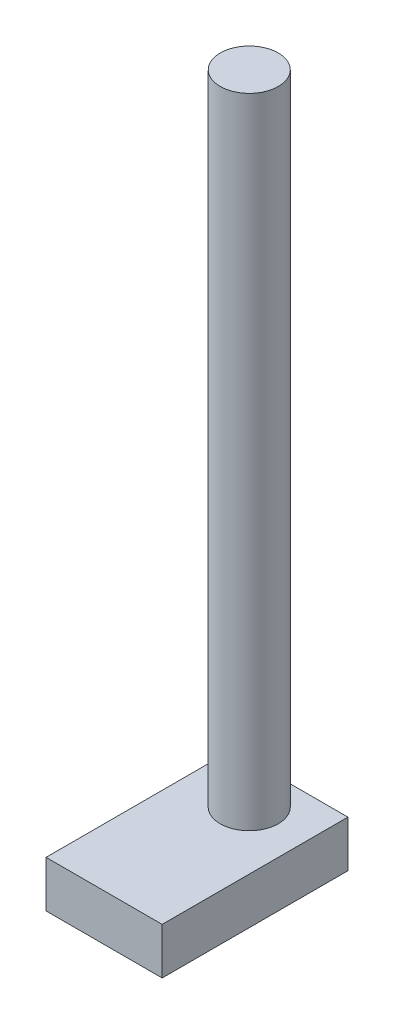
ISO-10303-21;
HEADER;
FILE_DESCRIPTION(('STEP AP214'),'2;1');
FILE_NAME('part.step','',(''),(''),'','','');
FILE_SCHEMA(('AUTOMOTIVE_DESIGN { 1 0 10303 214 1 1 1 1 }'));
ENDSEC;
DATA;
#1=APPLICATION_CONTEXT('core data for automotive mechanical design processes');
#2=APPLICATION_PROTOCOL_DEFINITION('international standard','automotive_design',2000,#1);
#3=PRODUCT_CONTEXT('',#1,'mechanical');
#4=PRODUCT('Part','Part','',(#3));
#5=PRODUCT_RELATED_PRODUCT_CATEGORY('part','',(#4));
#6=PRODUCT_DEFINITION_FORMATION('','',#4);
#7=PRODUCT_DEFINITION_CONTEXT('part definition',#1,'design');
#8=PRODUCT_DEFINITION('design','',#6,#7);
#9=PRODUCT_DEFINITION_SHAPE('','',#8);
#10=(LENGTH_UNIT() NAMED_UNIT(*) SI_UNIT(.MILLI.,.METRE.));
#11=(NAMED_UNIT(*) PLANE_ANGLE_UNIT() SI_UNIT($,.RADIAN.));
#12=(NAMED_UNIT(*) SI_UNIT($,.STERADIAN.) SOLID_ANGLE_UNIT());
#13=UNCERTAINTY_MEASURE_WITH_UNIT(LENGTH_MEASURE(1.E-05),#10,'distance_accuracy_value','');
#14=(GEOMETRIC_REPRESENTATION_CONTEXT(3) GLOBAL_UNCERTAINTY_ASSIGNED_CONTEXT((#13)) GLOBAL_UNIT_ASSIGNED_CONTEXT((#10,
#11,#12)) REPRESENTATION_CONTEXT('',''));
#15=CARTESIAN_POINT('',(0.,0.,0.));
#16=DIRECTION('',(0.,0.,1.));
#17=DIRECTION('',(1.,0.,0.));
#18=AXIS2_PLACEMENT_3D('',#15,#16,#17);
#19=CARTESIAN_POINT('',(-60.009659713746,40.,-18.5580204778157));
#20=DIRECTION('',(1.,0.,0.));
#21=DIRECTION('',(0.,0.,-1.));
#22=AXIS2_PLACEMENT_3D('',#19,#20,#21);
#23=PLANE('',#22);
#24=DIRECTION('',(0.,0.,1.));
#25=VECTOR('',#24,1.);
#26=CARTESIAN_POINT('',(-60.009659713746,0.,-18.5580204778157));
#27=LINE('',#26,#25);
#28=CARTESIAN_POINT('',(-60.009659713746,0.,-18.5580204778157));
#29=VERTEX_POINT('',#28);
#30=CARTESIAN_POINT('',(-60.009659713746,0.,141.441979522184));
#31=VERTEX_POINT('',#30);
#32=EDGE_CURVE('E97',#29,#31,#27,.T.);
#33=ORIENTED_EDGE('',*,*,#32,.T.);
#34=DIRECTION('',(0.,-1.,0.));
#35=VECTOR('',#34,1.);
#36=CARTESIAN_POINT('',(-60.009659713746,40.,141.441979522184));
#37=LINE('',#36,#35);
#38=CARTESIAN_POINT('',(-60.009659713746,40.,141.441979522184));
#39=VERTEX_POINT('',#38);
#40=EDGE_CURVE('E11',#39,#31,#37,.T.);
#41=ORIENTED_EDGE('',*,*,#40,.F.);
#42=DIRECTION('',(0.,0.,1.));
#43=VECTOR('',#42,1.);
#44=CARTESIAN_POINT('',(-60.009659713746,40.,-18.5580204778157));
#45=LINE('',#44,#43);
#46=CARTESIAN_POINT('',(-60.009659713746,40.,-18.5580204778157));
#47=VERTEX_POINT('',#46);
#48=EDGE_CURVE('E85',#47,#39,#45,.T.);
#49=ORIENTED_EDGE('',*,*,#48,.F.);
#50=DIRECTION('',(0.,-1.,0.));
#51=VECTOR('',#50,1.);
#52=CARTESIAN_POINT('',(-60.009659713746,40.,-18.5580204778157));
#53=LINE('',#52,#51);
#54=EDGE_CURVE('E93',#47,#29,#53,.T.);
#55=ORIENTED_EDGE('',*,*,#54,.T.);
#56=EDGE_LOOP('',(#33,#41,#49,#55));
#57=FACE_BOUND('',#56,.T.);
#58=ADVANCED_FACE('F34',(#57),#23,.F.);
#59=CARTESIAN_POINT('',(-60.009659713746,40.,141.441979522184));
#60=DIRECTION('',(0.,0.,-1.));
#61=DIRECTION('',(-1.,0.,0.));
#62=AXIS2_PLACEMENT_3D('',#59,#60,#61);
#63=PLANE('',#62);
#64=DIRECTION('',(1.,0.,0.));
#65=VECTOR('',#64,1.);
#66=CARTESIAN_POINT('',(-60.009659713746,0.,141.441979522184));
#67=LINE('',#66,#65);
#68=CARTESIAN_POINT('',(39.990340286254,0.,141.441979522184));
#69=VERTEX_POINT('',#68);
#70=EDGE_CURVE('E89',#31,#69,#67,.T.);
#71=ORIENTED_EDGE('',*,*,#70,.T.);
#72=DIRECTION('',(0.,-1.,0.));
#73=VECTOR('',#72,1.);
#74=CARTESIAN_POINT('',(39.990340286254,40.,141.441979522184));
#75=LINE('',#74,#73);
#76=CARTESIAN_POINT('',(39.990340286254,40.,141.441979522184));
#77=VERTEX_POINT('',#76);
#78=EDGE_CURVE('E42',#77,#69,#75,.T.);
#79=ORIENTED_EDGE('',*,*,#78,.F.);
#80=DIRECTION('',(1.,0.,0.));
#81=VECTOR('',#80,1.);
#82=CARTESIAN_POINT('',(-60.009659713746,40.,141.441979522184));
#83=LINE('',#82,#81);
#84=EDGE_CURVE('E80',#39,#77,#83,.T.);
#85=ORIENTED_EDGE('',*,*,#84,.F.);
#86=ORIENTED_EDGE('',*,*,#40,.T.);
#87=EDGE_LOOP('',(#71,#79,#85,#86));
#88=FACE_BOUND('',#87,.T.);
#89=ADVANCED_FACE('F88',(#88),#63,.F.);
#90=CARTESIAN_POINT('',(39.990340286254,40.,-18.5580204778157));
#91=DIRECTION('',(-1.,0.,0.));
#92=DIRECTION('',(0.,0.,1.));
#93=AXIS2_PLACEMENT_3D('',#90,#91,#92);
#94=PLANE('',#93);
#95=DIRECTION('',(0.,0.,-1.));
#96=VECTOR('',#95,1.);
#97=CARTESIAN_POINT('',(39.990340286254,0.,-18.5580204778157));
#98=LINE('',#97,#96);
#99=CARTESIAN_POINT('',(39.990340286254,0.,-18.5580204778157));
#100=VERTEX_POINT('',#99);
#101=EDGE_CURVE('E67',#69,#100,#98,.T.);
#102=ORIENTED_EDGE('',*,*,#101,.T.);
#103=DIRECTION('',(0.,-1.,0.));
#104=VECTOR('',#103,1.);
#105=CARTESIAN_POINT('',(39.990340286254,40.,-18.5580204778157));
#106=LINE('',#105,#104);
#107=CARTESIAN_POINT('',(39.990340286254,40.,-18.5580204778157));
#108=VERTEX_POINT('',#107);
#109=EDGE_CURVE('E90',#108,#100,#106,.T.);
#110=ORIENTED_EDGE('',*,*,#109,.F.);
#111=DIRECTION('',(0.,0.,-1.));
#112=VECTOR('',#111,1.);
#113=CARTESIAN_POINT('',(39.990340286254,40.,-18.5580204778157));
#114=LINE('',#113,#112);
#115=EDGE_CURVE('E83',#77,#108,#114,.T.);
#116=ORIENTED_EDGE('',*,*,#115,.F.);
#117=ORIENTED_EDGE('',*,*,#78,.T.);
#118=EDGE_LOOP('',(#102,#110,#116,#117));
#119=FACE_BOUND('',#118,.T.);
#120=ADVANCED_FACE('F91',(#119),#94,.F.);
#121=CARTESIAN_POINT('',(-60.009659713746,40.,-18.5580204778157));
#122=DIRECTION('',(0.,0.,1.));
#123=DIRECTION('',(1.,0.,0.));
#124=AXIS2_PLACEMENT_3D('',#121,#122,#123);
#125=PLANE('',#124);
#126=DIRECTION('',(-1.,0.,0.));
#127=VECTOR('',#126,1.);
#128=CARTESIAN_POINT('',(-60.009659713746,0.,-18.5580204778157));
#129=LINE('',#128,#127);
#130=EDGE_CURVE('E73',#100,#29,#129,.T.);
#131=ORIENTED_EDGE('',*,*,#130,.T.);
#132=ORIENTED_EDGE('',*,*,#54,.F.);
#133=DIRECTION('',(-1.,0.,0.));
#134=VECTOR('',#133,1.);
#135=CARTESIAN_POINT('',(-60.009659713746,40.,-18.5580204778157));
#136=LINE('',#135,#134);
#137=EDGE_CURVE('E50',#108,#47,#136,.T.);
#138=ORIENTED_EDGE('',*,*,#137,.F.);
#139=ORIENTED_EDGE('',*,*,#109,.T.);
#140=EDGE_LOOP('',(#131,#132,#138,#139));
#141=FACE_BOUND('',#140,.T.);
#142=ADVANCED_FACE('F105',(#141),#125,.F.);
#143=CARTESIAN_POINT('',(0.,40.,0.));
#144=DIRECTION('',(0.,1.,0.));
#145=DIRECTION('',(0.,0.,1.));
#146=AXIS2_PLACEMENT_3D('',#143,#144,#145);
#147=PLANE('',#146);
#148=CARTESIAN_POINT('',(-10.009659713746,40.,16.4419795221843));
#149=DIRECTION('',(0.,1.,0.));
#150=DIRECTION('',(0.,0.,1.));
#151=AXIS2_PLACEMENT_3D('',#148,#149,#150);
#152=CIRCLE('',#151,25.);
#153=CARTESIAN_POINT('',(-10.009659713746,40.,41.4419795221843));
#154=VERTEX_POINT('',#153);
#155=EDGE_CURVE('E100',#154,#154,#152,.F.);
#156=ORIENTED_EDGE('',*,*,#155,.T.);
#157=EDGE_LOOP('',(#156));
#158=FACE_BOUND('',#157,.T.);
#159=ORIENTED_EDGE('',*,*,#48,.T.);
#160=ORIENTED_EDGE('',*,*,#84,.T.);
#161=ORIENTED_EDGE('',*,*,#115,.T.);
#162=ORIENTED_EDGE('',*,*,#137,.T.);
#163=EDGE_LOOP('',(#159,#160,#161,#162));
#164=FACE_BOUND('',#163,.T.);
#165=ADVANCED_FACE('F81',(#158,#164),#147,.T.);
#166=CARTESIAN_POINT('',(0.,0.,0.));
#167=DIRECTION('',(0.,1.,0.));
#168=DIRECTION('',(0.,0.,1.));
#169=AXIS2_PLACEMENT_3D('',#166,#167,#168);
#170=PLANE('',#169);
#171=ORIENTED_EDGE('',*,*,#32,.F.);
#172=ORIENTED_EDGE('',*,*,#130,.F.);
#173=ORIENTED_EDGE('',*,*,#101,.F.);
#174=ORIENTED_EDGE('',*,*,#70,.F.);
#175=EDGE_LOOP('',(#171,#172,#173,#174));
#176=FACE_BOUND('',#175,.T.);
#177=ADVANCED_FACE('F108',(#176),#170,.F.);
#178=CARTESIAN_POINT('',(-10.009659713746,590.,16.4419795221843));
#179=DIRECTION('',(0.,-1.,0.));
#180=DIRECTION('',(0.,0.,-1.));
#181=AXIS2_PLACEMENT_3D('',#178,#179,#180);
#182=CYLINDRICAL_SURFACE('',#181,25.);
#183=ORIENTED_EDGE('',*,*,#155,.F.);
#184=EDGE_LOOP('',(#183));
#185=FACE_BOUND('',#184,.T.);
#186=CARTESIAN_POINT('',(-10.009659713746,590.,16.4419795221843));
#187=DIRECTION('',(0.,1.,0.));
#188=DIRECTION('',(0.,0.,1.));
#189=AXIS2_PLACEMENT_3D('',#186,#187,#188);
#190=CIRCLE('',#189,25.);
#191=CARTESIAN_POINT('',(-10.009659713746,590.,41.4419795221843));
#192=VERTEX_POINT('',#191);
#193=EDGE_CURVE('E113',#192,#192,#190,.T.);
#194=ORIENTED_EDGE('',*,*,#193,.F.);
#195=EDGE_LOOP('',(#194));
#196=FACE_BOUND('',#195,.T.);
#197=ADVANCED_FACE('F119',(#185,#196),#182,.T.);
#198=CARTESIAN_POINT('',(-10.009659713746,590.,16.4419795221843));
#199=DIRECTION('',(0.,1.,0.));
#200=DIRECTION('',(0.,0.,1.));
#201=AXIS2_PLACEMENT_3D('',#198,#199,#200);
#202=PLANE('',#201);
#203=ORIENTED_EDGE('',*,*,#193,.T.);
#204=EDGE_LOOP('',(#203));
#205=FACE_BOUND('',#204,.T.);
#206=ADVANCED_FACE('F117',(#205),#202,.T.);
#207=CLOSED_SHELL('',(#58,#89,#120,#142,#165,#177,#197,#206));
#208=MANIFOLD_SOLID_BREP('B2',#207);
#209=ADVANCED_BREP_SHAPE_REPRESENTATION('',(#18,#208),#14);
#210=SHAPE_DEFINITION_REPRESENTATION(#9,#209);
ENDSEC;
END-ISO-10303-21;
